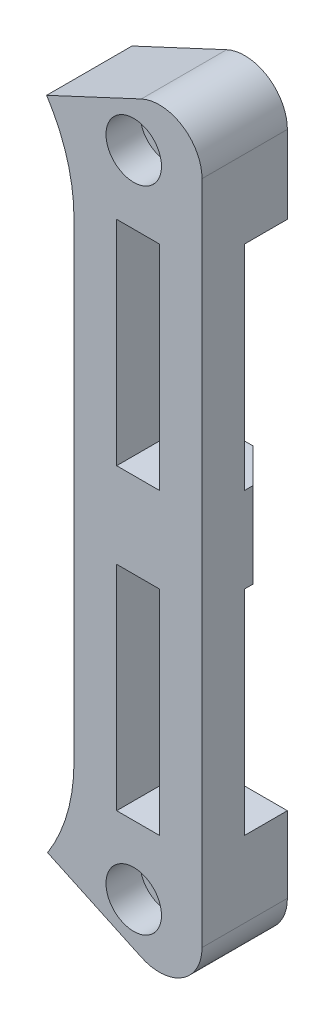
ISO-10303-21;
HEADER;
FILE_DESCRIPTION(('STEP AP214'),'2;1');
FILE_NAME('part.step','',(''),(''),'','','');
FILE_SCHEMA(('AUTOMOTIVE_DESIGN { 1 0 10303 214 1 1 1 1 }'));
ENDSEC;
DATA;
#1=APPLICATION_CONTEXT('core data for automotive mechanical design processes');
#2=APPLICATION_PROTOCOL_DEFINITION('international standard','automotive_design',2000,#1);
#3=PRODUCT_CONTEXT('',#1,'mechanical');
#4=PRODUCT('Part','Part','',(#3));
#5=PRODUCT_RELATED_PRODUCT_CATEGORY('part','',(#4));
#6=PRODUCT_DEFINITION_FORMATION('','',#4);
#7=PRODUCT_DEFINITION_CONTEXT('part definition',#1,'design');
#8=PRODUCT_DEFINITION('design','',#6,#7);
#9=PRODUCT_DEFINITION_SHAPE('','',#8);
#10=(LENGTH_UNIT() NAMED_UNIT(*) SI_UNIT(.MILLI.,.METRE.));
#11=(NAMED_UNIT(*) PLANE_ANGLE_UNIT() SI_UNIT($,.RADIAN.));
#12=(NAMED_UNIT(*) SI_UNIT($,.STERADIAN.) SOLID_ANGLE_UNIT());
#13=UNCERTAINTY_MEASURE_WITH_UNIT(LENGTH_MEASURE(1.E-05),#10,'distance_accuracy_value','');
#14=(GEOMETRIC_REPRESENTATION_CONTEXT(3) GLOBAL_UNCERTAINTY_ASSIGNED_CONTEXT((#13)) GLOBAL_UNIT_ASSIGNED_CONTEXT((#10,
#11,#12)) REPRESENTATION_CONTEXT('',''));
#15=CARTESIAN_POINT('',(0.,0.,0.));
#16=DIRECTION('',(0.,0.,1.));
#17=DIRECTION('',(1.,0.,0.));
#18=AXIS2_PLACEMENT_3D('',#15,#16,#17);
#19=CARTESIAN_POINT('',(-10.,76.7389258347136,4.99999999999999));
#20=DIRECTION('',(0.,0.,1.));
#21=DIRECTION('',(1.,0.,0.));
#22=AXIS2_PLACEMENT_3D('',#19,#20,#21);
#23=PLANE('',#22);
#24=DIRECTION('',(0.,-1.,0.));
#25=VECTOR('',#24,1.);
#26=CARTESIAN_POINT('',(0.,76.7389258347136,4.99999999999999));
#27=LINE('',#26,#25);
#28=CARTESIAN_POINT('',(0.,76.7389258347136,4.99999999999999));
#29=VERTEX_POINT('',#28);
#30=CARTESIAN_POINT('',(0.,51.7389258347136,4.99999999999999));
#31=VERTEX_POINT('',#30);
#32=EDGE_CURVE('E225',#29,#31,#27,.T.);
#33=ORIENTED_EDGE('',*,*,#32,.T.);
#34=DIRECTION('',(-1.,0.,0.));
#35=VECTOR('',#34,1.);
#36=CARTESIAN_POINT('',(-10.,51.7389258347136,4.99999999999999));
#37=LINE('',#36,#35);
#38=CARTESIAN_POINT('',(-3.,51.7389258347136,4.99999999999999));
#39=VERTEX_POINT('',#38);
#40=EDGE_CURVE('E348',#31,#39,#37,.T.);
#41=ORIENTED_EDGE('',*,*,#40,.T.);
#42=DIRECTION('',(0.,1.,0.));
#43=VECTOR('',#42,1.);
#44=CARTESIAN_POINT('',(-3.,76.7389258347136,4.99999999999999));
#45=LINE('',#44,#43);
#46=CARTESIAN_POINT('',(-3.,76.7389258347136,4.99999999999999));
#47=VERTEX_POINT('',#46);
#48=EDGE_CURVE('E309',#39,#47,#45,.T.);
#49=ORIENTED_EDGE('',*,*,#48,.T.);
#50=DIRECTION('',(1.,0.,0.));
#51=VECTOR('',#50,1.);
#52=CARTESIAN_POINT('',(-10.,76.7389258347136,4.99999999999999));
#53=LINE('',#52,#51);
#54=EDGE_CURVE('E235',#47,#29,#53,.T.);
#55=ORIENTED_EDGE('',*,*,#54,.T.);
#56=EDGE_LOOP('',(#33,#41,#49,#55));
#57=FACE_BOUND('',#56,.T.);
#58=ADVANCED_FACE('F33',(#57),#23,.F.);
#59=CARTESIAN_POINT('',(-10.,0.,0.));
#60=DIRECTION('',(-1.,0.,0.));
#61=DIRECTION('',(0.,0.,1.));
#62=AXIS2_PLACEMENT_3D('',#59,#60,#61);
#63=PLANE('',#62);
#64=DIRECTION('',(0.,-1.,0.));
#65=VECTOR('',#64,1.);
#66=CARTESIAN_POINT('',(-10.,74.3641428895241,10.));
#67=LINE('',#66,#65);
#68=CARTESIAN_POINT('',(-10.,76.7389258347136,10.));
#69=VERTEX_POINT('',#68);
#70=CARTESIAN_POINT('',(-10.,51.7389258347136,10.));
#71=VERTEX_POINT('',#70);
#72=EDGE_CURVE('E216',#69,#71,#67,.T.);
#73=ORIENTED_EDGE('',*,*,#72,.T.);
#74=DIRECTION('',(0.,0.,-1.));
#75=VECTOR('',#74,1.);
#76=CARTESIAN_POINT('',(-10.,51.7389258347136,0.));
#77=LINE('',#76,#75);
#78=CARTESIAN_POINT('',(-10.,51.7389258347136,0.));
#79=VERTEX_POINT('',#78);
#80=EDGE_CURVE('E363',#71,#79,#77,.T.);
#81=ORIENTED_EDGE('',*,*,#80,.T.);
#82=DIRECTION('',(0.,1.,0.));
#83=VECTOR('',#82,1.);
#84=CARTESIAN_POINT('',(-10.,76.7389258347136,0.));
#85=LINE('',#84,#83);
#86=CARTESIAN_POINT('',(-10.,76.7389258347136,0.));
#87=VERTEX_POINT('',#86);
#88=EDGE_CURVE('E211',#79,#87,#85,.T.);
#89=ORIENTED_EDGE('',*,*,#88,.T.);
#90=DIRECTION('',(0.,0.,1.));
#91=VECTOR('',#90,1.);
#92=CARTESIAN_POINT('',(-10.,76.7389258347136,0.));
#93=LINE('',#92,#91);
#94=EDGE_CURVE('E210',#87,#69,#93,.T.);
#95=ORIENTED_EDGE('',*,*,#94,.T.);
#96=EDGE_LOOP('',(#73,#81,#89,#95));
#97=FACE_BOUND('',#96,.T.);
#98=ADVANCED_FACE('F393',(#97),#63,.F.);
#99=CARTESIAN_POINT('',(-5.,76.7389258347136,15.));
#100=DIRECTION('',(1.,0.,0.));
#101=DIRECTION('',(0.,0.,-1.));
#102=AXIS2_PLACEMENT_3D('',#99,#100,#101);
#103=PLANE('',#102);
#104=DIRECTION('',(0.,-1.,0.));
#105=VECTOR('',#104,1.);
#106=CARTESIAN_POINT('',(-5.,76.7389258347136,6.99999999999999));
#107=LINE('',#106,#105);
#108=CARTESIAN_POINT('',(-5.,76.7389258347136,6.99999999999999));
#109=VERTEX_POINT('',#108);
#110=CARTESIAN_POINT('',(-5.,51.7389258347136,6.99999999999999));
#111=VERTEX_POINT('',#110);
#112=EDGE_CURVE('E306',#109,#111,#107,.T.);
#113=ORIENTED_EDGE('',*,*,#112,.T.);
#114=DIRECTION('',(0.,0.,1.));
#115=VECTOR('',#114,1.);
#116=CARTESIAN_POINT('',(-5.,51.7389258347136,15.));
#117=LINE('',#116,#115);
#118=CARTESIAN_POINT('',(-5.,51.7389258347136,10.));
#119=VERTEX_POINT('',#118);
#120=EDGE_CURVE('E196',#111,#119,#117,.T.);
#121=ORIENTED_EDGE('',*,*,#120,.T.);
#122=DIRECTION('',(0.,1.,0.));
#123=VECTOR('',#122,1.);
#124=CARTESIAN_POINT('',(-5.,74.3641428895241,10.));
#125=LINE('',#124,#123);
#126=CARTESIAN_POINT('',(-5.,76.7389258347136,10.));
#127=VERTEX_POINT('',#126);
#128=EDGE_CURVE('E383',#119,#127,#125,.T.);
#129=ORIENTED_EDGE('',*,*,#128,.T.);
#130=DIRECTION('',(0.,0.,-1.));
#131=VECTOR('',#130,1.);
#132=CARTESIAN_POINT('',(-5.,76.7389258347136,15.));
#133=LINE('',#132,#131);
#134=EDGE_CURVE('E321',#127,#109,#133,.T.);
#135=ORIENTED_EDGE('',*,*,#134,.T.);
#136=EDGE_LOOP('',(#113,#121,#129,#135));
#137=FACE_BOUND('',#136,.T.);
#138=ADVANCED_FACE('F460',(#137),#103,.F.);
#139=CARTESIAN_POINT('',(-5.,76.7389258347136,6.99999999999999));
#140=DIRECTION('',(0.707106781186547,0.,0.707106781186547));
#141=DIRECTION('',(0.,-1.,0.));
#142=AXIS2_PLACEMENT_3D('',#139,#140,#141);
#143=PLANE('',#142);
#144=DIRECTION('',(-0.707106781186548,0.,0.707106781186548));
#145=VECTOR('',#144,1.);
#146=CARTESIAN_POINT('',(-5.,51.7389258347136,6.99999999999999));
#147=LINE('',#146,#145);
#148=EDGE_CURVE('E330',#111,#39,#147,.F.);
#149=ORIENTED_EDGE('',*,*,#148,.F.);
#150=ORIENTED_EDGE('',*,*,#112,.F.);
#151=DIRECTION('',(0.707106781186548,0.,-0.707106781186548));
#152=VECTOR('',#151,1.);
#153=CARTESIAN_POINT('',(-4.,76.7389258347136,5.99999999999999));
#154=LINE('',#153,#152);
#155=EDGE_CURVE('E315',#47,#109,#154,.F.);
#156=ORIENTED_EDGE('',*,*,#155,.F.);
#157=ORIENTED_EDGE('',*,*,#48,.F.);
#158=EDGE_LOOP('',(#149,#150,#156,#157));
#159=FACE_BOUND('',#158,.T.);
#160=ADVANCED_FACE('F458',(#159),#143,.F.);
#161=CARTESIAN_POINT('',(-8.00000000000024,8.73892583471362,10.));
#162=DIRECTION('',(0.,0.,-1.));
#163=DIRECTION('',(-1.,0.,0.));
#164=AXIS2_PLACEMENT_3D('',#161,#162,#163);
#165=CYLINDRICAL_SURFACE('',#164,2.);
#166=CARTESIAN_POINT('',(-8.00000000000024,8.73892583471362,0.));
#167=DIRECTION('',(0.,0.,1.));
#168=DIRECTION('',(1.,0.,0.));
#169=AXIS2_PLACEMENT_3D('',#166,#167,#168);
#170=CIRCLE('',#169,2.);
#171=CARTESIAN_POINT('',(-6.00000000000024,8.73892583471362,0.));
#172=VERTEX_POINT('',#171);
#173=EDGE_CURVE('E240',#172,#172,#170,.T.);
#174=ORIENTED_EDGE('',*,*,#173,.F.);
#175=EDGE_LOOP('',(#174));
#176=FACE_BOUND('',#175,.T.);
#177=CARTESIAN_POINT('',(-8.00000000000024,8.73892583471362,6.));
#178=DIRECTION('',(0.,0.,1.));
#179=DIRECTION('',(1.,0.,0.));
#180=AXIS2_PLACEMENT_3D('',#177,#178,#179);
#181=CIRCLE('',#180,2.);
#182=CARTESIAN_POINT('',(-6.00000000000024,8.73892583471362,6.));
#183=VERTEX_POINT('',#182);
#184=EDGE_CURVE('E323',#183,#183,#181,.T.);
#185=ORIENTED_EDGE('',*,*,#184,.T.);
#186=EDGE_LOOP('',(#185));
#187=FACE_BOUND('',#186,.T.);
#188=ADVANCED_FACE('F468',(#176,#187),#165,.F.);
#189=CARTESIAN_POINT('',(-8.00000000000021,84.7389258347136,10.));
#190=DIRECTION('',(0.,0.,-1.));
#191=DIRECTION('',(-1.,0.,0.));
#192=AXIS2_PLACEMENT_3D('',#189,#190,#191);
#193=CYLINDRICAL_SURFACE('',#192,2.);
#194=CARTESIAN_POINT('',(-8.00000000000021,84.7389258347136,0.));
#195=DIRECTION('',(0.,0.,1.));
#196=DIRECTION('',(1.,0.,0.));
#197=AXIS2_PLACEMENT_3D('',#194,#195,#196);
#198=CIRCLE('',#197,2.);
#199=CARTESIAN_POINT('',(-6.00000000000021,84.7389258347136,0.));
#200=VERTEX_POINT('',#199);
#201=EDGE_CURVE('E231',#200,#200,#198,.T.);
#202=ORIENTED_EDGE('',*,*,#201,.F.);
#203=EDGE_LOOP('',(#202));
#204=FACE_BOUND('',#203,.T.);
#205=CARTESIAN_POINT('',(-8.00000000000021,84.7389258347136,6.));
#206=DIRECTION('',(0.,0.,1.));
#207=DIRECTION('',(1.,0.,0.));
#208=AXIS2_PLACEMENT_3D('',#205,#206,#207);
#209=CIRCLE('',#208,2.);
#210=CARTESIAN_POINT('',(-6.00000000000021,84.7389258347136,6.));
#211=VERTEX_POINT('',#210);
#212=EDGE_CURVE('E318',#211,#211,#209,.T.);
#213=ORIENTED_EDGE('',*,*,#212,.T.);
#214=EDGE_LOOP('',(#213));
#215=FACE_BOUND('',#214,.T.);
#216=ADVANCED_FACE('F591',(#204,#215),#193,.F.);
#217=CARTESIAN_POINT('',(-34.9999998912664,74.3641428895241,10.));
#218=DIRECTION('',(0.,0.,1.));
#219=DIRECTION('',(1.,0.,0.));
#220=AXIS2_PLACEMENT_3D('',#217,#218,#219);
#221=PLANE('',#220);
#222=ORIENTED_EDGE('',*,*,#128,.F.);
#223=DIRECTION('',(1.,0.,0.));
#224=VECTOR('',#223,1.);
#225=CARTESIAN_POINT('',(-14.,51.7389258347136,10.));
#226=LINE('',#225,#224);
#227=EDGE_CURVE('E353',#71,#119,#226,.T.);
#228=ORIENTED_EDGE('',*,*,#227,.F.);
#229=ORIENTED_EDGE('',*,*,#72,.F.);
#230=DIRECTION('',(-1.,0.,0.));
#231=VECTOR('',#230,1.);
#232=CARTESIAN_POINT('',(-34.9999998912664,76.7389258347136,10.));
#233=LINE('',#232,#231);
#234=EDGE_CURVE('E378',#127,#69,#233,.T.);
#235=ORIENTED_EDGE('',*,*,#234,.F.);
#236=EDGE_LOOP('',(#222,#228,#229,#235));
#237=FACE_BOUND('',#236,.T.);
#238=CARTESIAN_POINT('',(-10.,41.7389258347136,10.));
#239=VERTEX_POINT('',#238);
#240=CARTESIAN_POINT('',(-10.,16.7389258347136,10.));
#241=VERTEX_POINT('',#240);
#242=EDGE_CURVE('E386',#239,#241,#67,.T.);
#243=ORIENTED_EDGE('',*,*,#242,.F.);
#244=DIRECTION('',(1.,0.,0.));
#245=VECTOR('',#244,1.);
#246=CARTESIAN_POINT('',(-14.,41.7389258347136,10.));
#247=LINE('',#246,#245);
#248=CARTESIAN_POINT('',(-5.,41.7389258347136,10.));
#249=VERTEX_POINT('',#248);
#250=EDGE_CURVE('E192',#239,#249,#247,.T.);
#251=ORIENTED_EDGE('',*,*,#250,.T.);
#252=CARTESIAN_POINT('',(-5.,16.7389258347136,10.));
#253=VERTEX_POINT('',#252);
#254=EDGE_CURVE('E384',#253,#249,#125,.T.);
#255=ORIENTED_EDGE('',*,*,#254,.F.);
#256=DIRECTION('',(1.,0.,0.));
#257=VECTOR('',#256,1.);
#258=CARTESIAN_POINT('',(-34.9999998912664,16.7389258347136,10.));
#259=LINE('',#258,#257);
#260=EDGE_CURVE('E385',#241,#253,#259,.T.);
#261=ORIENTED_EDGE('',*,*,#260,.F.);
#262=EDGE_LOOP('',(#243,#251,#255,#261));
#263=FACE_BOUND('',#262,.T.);
#264=DIRECTION('',(0.,1.,0.));
#265=VECTOR('',#264,1.);
#266=CARTESIAN_POINT('',(0.,93.7107928727129,10.));
#267=LINE('',#266,#265);
#268=CARTESIAN_POINT('',(0.,7.84842788558751,10.));
#269=VERTEX_POINT('',#268);
#270=CARTESIAN_POINT('',(0.,85.8623649871254,10.));
#271=VERTEX_POINT('',#270);
#272=EDGE_CURVE('E255',#269,#271,#267,.T.);
#273=ORIENTED_EDGE('',*,*,#272,.T.);
#274=CARTESIAN_POINT('',(-5.,85.8623649871254,10.));
#275=DIRECTION('',(0.,0.,1.));
#276=DIRECTION('',(1.,0.,0.));
#277=AXIS2_PLACEMENT_3D('',#274,#275,#276);
#278=CIRCLE('',#277,5.);
#279=CARTESIAN_POINT('',(-7.11309130870352,90.3939039223087,10.));
#280=VERTEX_POINT('',#279);
#281=EDGE_CURVE('E298',#271,#280,#278,.T.);
#282=ORIENTED_EDGE('',*,*,#281,.T.);
#283=DIRECTION('',(-0.906307787036648,-0.422618261740704,0.));
#284=VECTOR('',#283,1.);
#285=CARTESIAN_POINT('',(-18.2040333666436,85.2221127045378,10.));
#286=LINE('',#285,#284);
#287=CARTESIAN_POINT('',(-18.2040333666436,85.2221127045378,10.));
#288=VERTEX_POINT('',#287);
#289=EDGE_CURVE('E257',#280,#288,#286,.T.);
#290=ORIENTED_EDGE('',*,*,#289,.T.);
#291=CARTESIAN_POINT('',(-34.9999998912664,74.3641428895241,10.));
#292=DIRECTION('',(0.,0.,-1.));
#293=DIRECTION('',(1.,0.,0.));
#294=AXIS2_PLACEMENT_3D('',#291,#292,#293);
#295=CIRCLE('',#294,20.);
#296=CARTESIAN_POINT('',(-15.0000000000002,74.3620573798213,10.));
#297=VERTEX_POINT('',#296);
#298=EDGE_CURVE('E244',#288,#297,#295,.T.);
#299=ORIENTED_EDGE('',*,*,#298,.T.);
#300=DIRECTION('',(0.,-1.,0.));
#301=VECTOR('',#300,1.);
#302=CARTESIAN_POINT('',(-15.0000000000002,19.1157942896059,10.));
#303=LINE('',#302,#301);
#304=CARTESIAN_POINT('',(-15.0000000000002,19.1157942896059,10.));
#305=VERTEX_POINT('',#304);
#306=EDGE_CURVE('E247',#297,#305,#303,.T.);
#307=ORIENTED_EDGE('',*,*,#306,.T.);
#308=CARTESIAN_POINT('',(-35.0000000000002,19.1157942896059,10.));
#309=DIRECTION('',(0.,0.,-1.));
#310=DIRECTION('',(1.,0.,0.));
#311=AXIS2_PLACEMENT_3D('',#308,#309,#310);
#312=CIRCLE('',#311,20.);
#313=CARTESIAN_POINT('',(-18.0903807173959,8.43568306746135,10.));
#314=VERTEX_POINT('',#313);
#315=EDGE_CURVE('E250',#305,#314,#312,.T.);
#316=ORIENTED_EDGE('',*,*,#315,.T.);
#317=DIRECTION('',(0.906307787036648,-0.422618261740704,0.));
#318=VECTOR('',#317,1.);
#319=CARTESIAN_POINT('',(0.,0.,10.));
#320=LINE('',#319,#318);
#321=CARTESIAN_POINT('',(-7.11309130870352,3.31688895040425,10.));
#322=VERTEX_POINT('',#321);
#323=EDGE_CURVE('E252',#314,#322,#320,.T.);
#324=ORIENTED_EDGE('',*,*,#323,.T.);
#325=CARTESIAN_POINT('',(-5.,7.84842788558748,10.));
#326=DIRECTION('',(0.,0.,1.));
#327=DIRECTION('',(1.,0.,0.));
#328=AXIS2_PLACEMENT_3D('',#325,#326,#327);
#329=CIRCLE('',#328,5.);
#330=EDGE_CURVE('E300',#322,#269,#329,.T.);
#331=ORIENTED_EDGE('',*,*,#330,.T.);
#332=EDGE_LOOP('',(#273,#282,#290,#299,#307,#316,#324,#331));
#333=FACE_BOUND('',#332,.T.);
#334=CARTESIAN_POINT('',(-8.00000000000024,8.73892583471362,10.));
#335=DIRECTION('',(0.,0.,1.));
#336=DIRECTION('',(1.,0.,0.));
#337=AXIS2_PLACEMENT_3D('',#334,#335,#336);
#338=CIRCLE('',#337,3.25);
#339=CARTESIAN_POINT('',(-4.75000000000024,8.73892583471362,10.));
#340=VERTEX_POINT('',#339);
#341=EDGE_CURVE('E366',#340,#340,#338,.T.);
#342=ORIENTED_EDGE('',*,*,#341,.F.);
#343=EDGE_LOOP('',(#342));
#344=FACE_BOUND('',#343,.T.);
#345=CARTESIAN_POINT('',(-8.00000000000021,84.7389258347136,10.));
#346=DIRECTION('',(0.,0.,1.));
#347=DIRECTION('',(1.,0.,0.));
#348=AXIS2_PLACEMENT_3D('',#345,#346,#347);
#349=CIRCLE('',#348,3.25);
#350=CARTESIAN_POINT('',(-4.75000000000021,84.7389258347136,10.));
#351=VERTEX_POINT('',#350);
#352=EDGE_CURVE('E326',#351,#351,#349,.T.);
#353=ORIENTED_EDGE('',*,*,#352,.F.);
#354=EDGE_LOOP('',(#353));
#355=FACE_BOUND('',#354,.T.);
#356=ADVANCED_FACE('F400',(#237,#263,#333,#344,#355),#221,.T.);
#357=CARTESIAN_POINT('',(-34.9999998912664,74.3641428895241,0.));
#358=DIRECTION('',(0.,0.,1.));
#359=DIRECTION('',(1.,0.,0.));
#360=AXIS2_PLACEMENT_3D('',#357,#358,#359);
#361=PLANE('',#360);
#362=DIRECTION('',(1.,0.,0.));
#363=VECTOR('',#362,1.);
#364=CARTESIAN_POINT('',(-14.,51.7389258347136,0.));
#365=LINE('',#364,#363);
#366=CARTESIAN_POINT('',(-4.00000000000001,51.7389258347136,0.));
#367=VERTEX_POINT('',#366);
#368=EDGE_CURVE('E204',#79,#367,#365,.T.);
#369=ORIENTED_EDGE('',*,*,#368,.T.);
#370=DIRECTION('',(0.,-1.,0.));
#371=VECTOR('',#370,1.);
#372=CARTESIAN_POINT('',(-4.,74.3641428895241,0.));
#373=LINE('',#372,#371);
#374=CARTESIAN_POINT('',(-4.00000000000001,41.7389258347136,0.));
#375=VERTEX_POINT('',#374);
#376=EDGE_CURVE('E41',#367,#375,#373,.T.);
#377=ORIENTED_EDGE('',*,*,#376,.T.);
#378=DIRECTION('',(1.,0.,0.));
#379=VECTOR('',#378,1.);
#380=CARTESIAN_POINT('',(-14.,41.7389258347136,0.));
#381=LINE('',#380,#379);
#382=CARTESIAN_POINT('',(-10.,41.7389258347136,0.));
#383=VERTEX_POINT('',#382);
#384=EDGE_CURVE('E188',#383,#375,#381,.T.);
#385=ORIENTED_EDGE('',*,*,#384,.F.);
#386=CARTESIAN_POINT('',(-10.,16.7389258347136,0.));
#387=VERTEX_POINT('',#386);
#388=EDGE_CURVE('E203',#387,#383,#85,.T.);
#389=ORIENTED_EDGE('',*,*,#388,.F.);
#390=DIRECTION('',(1.,0.,0.));
#391=VECTOR('',#390,1.);
#392=CARTESIAN_POINT('',(-10.,16.7389258347136,0.));
#393=LINE('',#392,#391);
#394=CARTESIAN_POINT('',(0.,16.7389258347136,0.));
#395=VERTEX_POINT('',#394);
#396=EDGE_CURVE('E229',#387,#395,#393,.T.);
#397=ORIENTED_EDGE('',*,*,#396,.T.);
#398=DIRECTION('',(0.,1.,0.));
#399=VECTOR('',#398,1.);
#400=CARTESIAN_POINT('',(0.,93.7107928727129,0.));
#401=LINE('',#400,#399);
#402=CARTESIAN_POINT('',(0.,7.84842788558751,0.));
#403=VERTEX_POINT('',#402);
#404=EDGE_CURVE('E270',#403,#395,#401,.T.);
#405=ORIENTED_EDGE('',*,*,#404,.F.);
#406=CARTESIAN_POINT('',(-5.,7.84842788558748,0.));
#407=DIRECTION('',(0.,0.,1.));
#408=DIRECTION('',(1.,0.,0.));
#409=AXIS2_PLACEMENT_3D('',#406,#407,#408);
#410=CIRCLE('',#409,5.);
#411=CARTESIAN_POINT('',(-7.11309130870352,3.31688895040425,0.));
#412=VERTEX_POINT('',#411);
#413=EDGE_CURVE('E294',#403,#412,#410,.F.);
#414=ORIENTED_EDGE('',*,*,#413,.T.);
#415=DIRECTION('',(0.906307787036648,-0.422618261740704,0.));
#416=VECTOR('',#415,1.);
#417=CARTESIAN_POINT('',(0.,0.,0.));
#418=LINE('',#417,#416);
#419=CARTESIAN_POINT('',(-18.0903807173959,8.43568306746135,0.));
#420=VERTEX_POINT('',#419);
#421=EDGE_CURVE('E266',#420,#412,#418,.T.);
#422=ORIENTED_EDGE('',*,*,#421,.F.);
#423=CARTESIAN_POINT('',(-35.0000000000002,19.1157942896059,0.));
#424=DIRECTION('',(0.,0.,-1.));
#425=DIRECTION('',(1.,0.,0.));
#426=AXIS2_PLACEMENT_3D('',#423,#424,#425);
#427=CIRCLE('',#426,20.);
#428=CARTESIAN_POINT('',(-15.0000000000002,19.1157942896059,0.));
#429=VERTEX_POINT('',#428);
#430=EDGE_CURVE('E264',#429,#420,#427,.T.);
#431=ORIENTED_EDGE('',*,*,#430,.F.);
#432=DIRECTION('',(0.,-1.,0.));
#433=VECTOR('',#432,1.);
#434=CARTESIAN_POINT('',(-15.0000000000002,19.1157942896059,0.));
#435=LINE('',#434,#433);
#436=CARTESIAN_POINT('',(-15.0000000000002,74.3620573798213,0.));
#437=VERTEX_POINT('',#436);
#438=EDGE_CURVE('E262',#437,#429,#435,.T.);
#439=ORIENTED_EDGE('',*,*,#438,.F.);
#440=CARTESIAN_POINT('',(-34.9999998912664,74.3641428895241,0.));
#441=DIRECTION('',(0.,0.,-1.));
#442=DIRECTION('',(1.,0.,0.));
#443=AXIS2_PLACEMENT_3D('',#440,#441,#442);
#444=CIRCLE('',#443,20.);
#445=CARTESIAN_POINT('',(-18.2040333666436,85.2221127045378,0.));
#446=VERTEX_POINT('',#445);
#447=EDGE_CURVE('E243',#446,#437,#444,.T.);
#448=ORIENTED_EDGE('',*,*,#447,.F.);
#449=DIRECTION('',(-0.906307787036648,-0.422618261740704,0.));
#450=VECTOR('',#449,1.);
#451=CARTESIAN_POINT('',(-18.2040333666436,85.2221127045378,0.));
#452=LINE('',#451,#450);
#453=CARTESIAN_POINT('',(-7.11309130870352,90.3939039223087,0.));
#454=VERTEX_POINT('',#453);
#455=EDGE_CURVE('E248',#454,#446,#452,.T.);
#456=ORIENTED_EDGE('',*,*,#455,.F.);
#457=CARTESIAN_POINT('',(-5.,85.8623649871254,0.));
#458=DIRECTION('',(0.,0.,1.));
#459=DIRECTION('',(1.,0.,0.));
#460=AXIS2_PLACEMENT_3D('',#457,#458,#459);
#461=CIRCLE('',#460,5.);
#462=CARTESIAN_POINT('',(0.,85.8623649871254,0.));
#463=VERTEX_POINT('',#462);
#464=EDGE_CURVE('E291',#454,#463,#461,.F.);
#465=ORIENTED_EDGE('',*,*,#464,.T.);
#466=CARTESIAN_POINT('',(0.,76.7389258347136,0.));
#467=VERTEX_POINT('',#466);
#468=EDGE_CURVE('E269',#467,#463,#401,.T.);
#469=ORIENTED_EDGE('',*,*,#468,.F.);
#470=DIRECTION('',(1.,0.,0.));
#471=VECTOR('',#470,1.);
#472=CARTESIAN_POINT('',(-10.,76.7389258347136,0.));
#473=LINE('',#472,#471);
#474=EDGE_CURVE('E220',#87,#467,#473,.T.);
#475=ORIENTED_EDGE('',*,*,#474,.F.);
#476=ORIENTED_EDGE('',*,*,#88,.F.);
#477=EDGE_LOOP('',(#369,#377,#385,#389,#397,#405,#414,#422,#431,#439,#448,#456,#465,#469,#475,#476));
#478=FACE_BOUND('',#477,.T.);
#479=ORIENTED_EDGE('',*,*,#173,.T.);
#480=EDGE_LOOP('',(#479));
#481=FACE_BOUND('',#480,.T.);
#482=ORIENTED_EDGE('',*,*,#201,.T.);
#483=EDGE_LOOP('',(#482));
#484=FACE_BOUND('',#483,.T.);
#485=ADVANCED_FACE('F200',(#478,#481,#484),#361,.F.);
#486=CARTESIAN_POINT('',(-34.9999998912664,74.3641428895241,10.));
#487=DIRECTION('',(0.,0.,-1.));
#488=DIRECTION('',(-1.,0.,0.));
#489=AXIS2_PLACEMENT_3D('',#486,#487,#488);
#490=CYLINDRICAL_SURFACE('',#489,20.);
#491=ORIENTED_EDGE('',*,*,#447,.T.);
#492=DIRECTION('',(0.,0.,-1.));
#493=VECTOR('',#492,1.);
#494=CARTESIAN_POINT('',(-15.0000000000002,74.3620573798213,10.));
#495=LINE('',#494,#493);
#496=EDGE_CURVE('E282',#297,#437,#495,.T.);
#497=ORIENTED_EDGE('',*,*,#496,.F.);
#498=ORIENTED_EDGE('',*,*,#298,.F.);
#499=DIRECTION('',(0.,0.,-1.));
#500=VECTOR('',#499,1.);
#501=CARTESIAN_POINT('',(-18.2040333666436,85.2221127045378,10.));
#502=LINE('',#501,#500);
#503=EDGE_CURVE('E259',#288,#446,#502,.T.);
#504=ORIENTED_EDGE('',*,*,#503,.T.);
#505=EDGE_LOOP('',(#491,#497,#498,#504));
#506=FACE_BOUND('',#505,.T.);
#507=ADVANCED_FACE('F442',(#506),#490,.F.);
#508=CARTESIAN_POINT('',(-15.0000000000002,19.1157942896059,10.));
#509=DIRECTION('',(1.,0.,0.));
#510=DIRECTION('',(0.,0.,-1.));
#511=AXIS2_PLACEMENT_3D('',#508,#509,#510);
#512=PLANE('',#511);
#513=ORIENTED_EDGE('',*,*,#438,.T.);
#514=DIRECTION('',(0.,0.,-1.));
#515=VECTOR('',#514,1.);
#516=CARTESIAN_POINT('',(-15.0000000000002,19.1157942896059,10.));
#517=LINE('',#516,#515);
#518=EDGE_CURVE('E279',#305,#429,#517,.T.);
#519=ORIENTED_EDGE('',*,*,#518,.F.);
#520=ORIENTED_EDGE('',*,*,#306,.F.);
#521=ORIENTED_EDGE('',*,*,#496,.T.);
#522=EDGE_LOOP('',(#513,#519,#520,#521));
#523=FACE_BOUND('',#522,.T.);
#524=ADVANCED_FACE('F446',(#523),#512,.F.);
#525=CARTESIAN_POINT('',(-35.0000000000002,19.1157942896059,10.));
#526=DIRECTION('',(0.,0.,-1.));
#527=DIRECTION('',(-1.,0.,0.));
#528=AXIS2_PLACEMENT_3D('',#525,#526,#527);
#529=CYLINDRICAL_SURFACE('',#528,20.);
#530=ORIENTED_EDGE('',*,*,#430,.T.);
#531=DIRECTION('',(0.,0.,-1.));
#532=VECTOR('',#531,1.);
#533=CARTESIAN_POINT('',(-18.0903807173959,8.43568306746135,10.));
#534=LINE('',#533,#532);
#535=EDGE_CURVE('E276',#314,#420,#534,.T.);
#536=ORIENTED_EDGE('',*,*,#535,.F.);
#537=ORIENTED_EDGE('',*,*,#315,.F.);
#538=ORIENTED_EDGE('',*,*,#518,.T.);
#539=EDGE_LOOP('',(#530,#536,#537,#538));
#540=FACE_BOUND('',#539,.T.);
#541=ADVANCED_FACE('F448',(#540),#529,.F.);
#542=CARTESIAN_POINT('',(0.,0.,10.));
#543=DIRECTION('',(0.422618261740704,0.906307787036648,0.));
#544=DIRECTION('',(-0.906307787036648,0.422618261740704,0.));
#545=AXIS2_PLACEMENT_3D('',#542,#543,#544);
#546=PLANE('',#545);
#547=ORIENTED_EDGE('',*,*,#421,.T.);
#548=DIRECTION('',(0.,0.,-1.));
#549=VECTOR('',#548,1.);
#550=CARTESIAN_POINT('',(-7.11309130870352,3.31688895040425,10.));
#551=LINE('',#550,#549);
#552=EDGE_CURVE('E296',#412,#322,#551,.F.);
#553=ORIENTED_EDGE('',*,*,#552,.T.);
#554=ORIENTED_EDGE('',*,*,#323,.F.);
#555=ORIENTED_EDGE('',*,*,#535,.T.);
#556=EDGE_LOOP('',(#547,#553,#554,#555));
#557=FACE_BOUND('',#556,.T.);
#558=ADVANCED_FACE('F418',(#557),#546,.F.);
#559=CARTESIAN_POINT('',(0.,93.7107928727129,10.));
#560=DIRECTION('',(-1.,0.,0.));
#561=DIRECTION('',(0.,0.,1.));
#562=AXIS2_PLACEMENT_3D('',#559,#560,#561);
#563=PLANE('',#562);
#564=DIRECTION('',(0.,0.,-1.));
#565=VECTOR('',#564,1.);
#566=CARTESIAN_POINT('',(0.,41.7389258347136,10.));
#567=LINE('',#566,#565);
#568=CARTESIAN_POINT('',(0.,41.7389258347136,4.99999999999999));
#569=VERTEX_POINT('',#568);
#570=CARTESIAN_POINT('',(0.,41.7389258347136,3.99999999999999));
#571=VERTEX_POINT('',#570);
#572=EDGE_CURVE('E344',#569,#571,#567,.T.);
#573=ORIENTED_EDGE('',*,*,#572,.T.);
#574=DIRECTION('',(0.,1.,0.));
#575=VECTOR('',#574,1.);
#576=CARTESIAN_POINT('',(0.,93.7107928727129,3.99999999999999));
#577=LINE('',#576,#575);
#578=CARTESIAN_POINT('',(0.,51.7389258347136,3.99999999999999));
#579=VERTEX_POINT('',#578);
#580=EDGE_CURVE('E333',#571,#579,#577,.T.);
#581=ORIENTED_EDGE('',*,*,#580,.T.);
#582=DIRECTION('',(0.,0.,1.));
#583=VECTOR('',#582,1.);
#584=CARTESIAN_POINT('',(0.,51.7389258347136,10.));
#585=LINE('',#584,#583);
#586=EDGE_CURVE('E341',#579,#31,#585,.T.);
#587=ORIENTED_EDGE('',*,*,#586,.T.);
#588=ORIENTED_EDGE('',*,*,#32,.F.);
#589=DIRECTION('',(0.,0.,1.));
#590=VECTOR('',#589,1.);
#591=CARTESIAN_POINT('',(0.,76.7389258347136,0.));
#592=LINE('',#591,#590);
#593=EDGE_CURVE('E221',#467,#29,#592,.T.);
#594=ORIENTED_EDGE('',*,*,#593,.F.);
#595=ORIENTED_EDGE('',*,*,#468,.T.);
#596=DIRECTION('',(0.,0.,-1.));
#597=VECTOR('',#596,1.);
#598=CARTESIAN_POINT('',(0.,85.8623649871254,10.));
#599=LINE('',#598,#597);
#600=EDGE_CURVE('E285',#463,#271,#599,.F.);
#601=ORIENTED_EDGE('',*,*,#600,.T.);
#602=ORIENTED_EDGE('',*,*,#272,.F.);
#603=DIRECTION('',(0.,0.,-1.));
#604=VECTOR('',#603,1.);
#605=CARTESIAN_POINT('',(0.,7.84842788558748,10.));
#606=LINE('',#605,#604);
#607=EDGE_CURVE('E288',#269,#403,#606,.T.);
#608=ORIENTED_EDGE('',*,*,#607,.T.);
#609=ORIENTED_EDGE('',*,*,#404,.T.);
#610=DIRECTION('',(0.,0.,-1.));
#611=VECTOR('',#610,1.);
#612=CARTESIAN_POINT('',(0.,16.7389258347136,0.));
#613=LINE('',#612,#611);
#614=CARTESIAN_POINT('',(0.,16.7389258347136,4.99999999999999));
#615=VERTEX_POINT('',#614);
#616=EDGE_CURVE('E214',#615,#395,#613,.T.);
#617=ORIENTED_EDGE('',*,*,#616,.F.);
#618=EDGE_CURVE('E224',#569,#615,#27,.T.);
#619=ORIENTED_EDGE('',*,*,#618,.F.);
#620=EDGE_LOOP('',(#573,#581,#587,#588,#594,#595,#601,#602,#608,#609,#617,#619));
#621=FACE_BOUND('',#620,.T.);
#622=ADVANCED_FACE('F339',(#621),#563,.F.);
#623=CARTESIAN_POINT('',(-18.2040333666436,85.2221127045378,10.));
#624=DIRECTION('',(0.422618261740704,-0.906307787036648,0.));
#625=DIRECTION('',(0.906307787036648,0.422618261740704,0.));
#626=AXIS2_PLACEMENT_3D('',#623,#624,#625);
#627=PLANE('',#626);
#628=ORIENTED_EDGE('',*,*,#289,.F.);
#629=DIRECTION('',(0.,0.,-1.));
#630=VECTOR('',#629,1.);
#631=CARTESIAN_POINT('',(-7.11309130870352,90.3939039223087,10.));
#632=LINE('',#631,#630);
#633=EDGE_CURVE('E302',#280,#454,#632,.T.);
#634=ORIENTED_EDGE('',*,*,#633,.T.);
#635=ORIENTED_EDGE('',*,*,#455,.T.);
#636=ORIENTED_EDGE('',*,*,#503,.F.);
#637=EDGE_LOOP('',(#628,#634,#635,#636));
#638=FACE_BOUND('',#637,.T.);
#639=ADVANCED_FACE('F436',(#638),#627,.F.);
#640=CARTESIAN_POINT('',(-5.,7.84842788558748,10.));
#641=DIRECTION('',(0.,0.,-1.));
#642=DIRECTION('',(-1.,0.,0.));
#643=AXIS2_PLACEMENT_3D('',#640,#641,#642);
#644=CYLINDRICAL_SURFACE('',#643,5.);
#645=ORIENTED_EDGE('',*,*,#330,.F.);
#646=ORIENTED_EDGE('',*,*,#552,.F.);
#647=ORIENTED_EDGE('',*,*,#413,.F.);
#648=ORIENTED_EDGE('',*,*,#607,.F.);
#649=EDGE_LOOP('',(#645,#646,#647,#648));
#650=FACE_BOUND('',#649,.T.);
#651=ADVANCED_FACE('F422',(#650),#644,.T.);
#652=CARTESIAN_POINT('',(-5.,85.8623649871254,10.));
#653=DIRECTION('',(0.,0.,-1.));
#654=DIRECTION('',(-1.,0.,0.));
#655=AXIS2_PLACEMENT_3D('',#652,#653,#654);
#656=CYLINDRICAL_SURFACE('',#655,5.);
#657=ORIENTED_EDGE('',*,*,#281,.F.);
#658=ORIENTED_EDGE('',*,*,#600,.F.);
#659=ORIENTED_EDGE('',*,*,#464,.F.);
#660=ORIENTED_EDGE('',*,*,#633,.F.);
#661=EDGE_LOOP('',(#657,#658,#659,#660));
#662=FACE_BOUND('',#661,.T.);
#663=ADVANCED_FACE('F432',(#662),#656,.T.);
#664=CARTESIAN_POINT('',(-10.,16.7389258347136,0.));
#665=DIRECTION('',(0.,-1.,0.));
#666=DIRECTION('',(0.,0.,-1.));
#667=AXIS2_PLACEMENT_3D('',#664,#665,#666);
#668=PLANE('',#667);
#669=ORIENTED_EDGE('',*,*,#616,.T.);
#670=ORIENTED_EDGE('',*,*,#396,.F.);
#671=DIRECTION('',(0.,0.,-1.));
#672=VECTOR('',#671,1.);
#673=CARTESIAN_POINT('',(-10.,16.7389258347136,0.));
#674=LINE('',#673,#672);
#675=EDGE_CURVE('E209',#241,#387,#674,.T.);
#676=ORIENTED_EDGE('',*,*,#675,.F.);
#677=ORIENTED_EDGE('',*,*,#260,.T.);
#678=DIRECTION('',(0.,0.,-1.));
#679=VECTOR('',#678,1.);
#680=CARTESIAN_POINT('',(-5.,16.7389258347136,15.));
#681=LINE('',#680,#679);
#682=CARTESIAN_POINT('',(-5.,16.7389258347136,6.99999999999999));
#683=VERTEX_POINT('',#682);
#684=EDGE_CURVE('E375',#253,#683,#681,.T.);
#685=ORIENTED_EDGE('',*,*,#684,.T.);
#686=DIRECTION('',(-0.707106781186548,0.,0.707106781186548));
#687=VECTOR('',#686,1.);
#688=CARTESIAN_POINT('',(-4.,16.7389258347136,5.99999999999999));
#689=LINE('',#688,#687);
#690=CARTESIAN_POINT('',(-3.,16.7389258347136,4.99999999999999));
#691=VERTEX_POINT('',#690);
#692=EDGE_CURVE('E313',#683,#691,#689,.F.);
#693=ORIENTED_EDGE('',*,*,#692,.T.);
#694=DIRECTION('',(1.,0.,0.));
#695=VECTOR('',#694,1.);
#696=CARTESIAN_POINT('',(-10.,16.7389258347136,4.99999999999999));
#697=LINE('',#696,#695);
#698=EDGE_CURVE('E232',#691,#615,#697,.T.);
#699=ORIENTED_EDGE('',*,*,#698,.T.);
#700=EDGE_LOOP('',(#669,#670,#676,#677,#685,#693,#699));
#701=FACE_BOUND('',#700,.T.);
#702=ADVANCED_FACE('F411',(#701),#668,.F.);
#703=CARTESIAN_POINT('',(-3.,41.7389258347136,4.99999999999999));
#704=VERTEX_POINT('',#703);
#705=EDGE_CURVE('E310',#691,#704,#45,.T.);
#706=ORIENTED_EDGE('',*,*,#705,.T.);
#707=DIRECTION('',(1.,0.,0.));
#708=VECTOR('',#707,1.);
#709=CARTESIAN_POINT('',(-10.,41.7389258347136,4.99999999999999));
#710=LINE('',#709,#708);
#711=EDGE_CURVE('E197',#704,#569,#710,.T.);
#712=ORIENTED_EDGE('',*,*,#711,.T.);
#713=ORIENTED_EDGE('',*,*,#618,.T.);
#714=ORIENTED_EDGE('',*,*,#698,.F.);
#715=EDGE_LOOP('',(#706,#712,#713,#714));
#716=FACE_BOUND('',#715,.T.);
#717=ADVANCED_FACE('F406',(#716),#23,.F.);
#718=CARTESIAN_POINT('',(-10.,76.7389258347136,0.));
#719=DIRECTION('',(0.,1.,0.));
#720=DIRECTION('',(0.,0.,1.));
#721=AXIS2_PLACEMENT_3D('',#718,#719,#720);
#722=PLANE('',#721);
#723=ORIENTED_EDGE('',*,*,#593,.T.);
#724=ORIENTED_EDGE('',*,*,#54,.F.);
#725=ORIENTED_EDGE('',*,*,#155,.T.);
#726=ORIENTED_EDGE('',*,*,#134,.F.);
#727=ORIENTED_EDGE('',*,*,#234,.T.);
#728=ORIENTED_EDGE('',*,*,#94,.F.);
#729=ORIENTED_EDGE('',*,*,#474,.T.);
#730=EDGE_LOOP('',(#723,#724,#725,#726,#727,#728,#729));
#731=FACE_BOUND('',#730,.T.);
#732=ADVANCED_FACE('F450',(#731),#722,.F.);
#733=ORIENTED_EDGE('',*,*,#388,.T.);
#734=DIRECTION('',(0.,0.,1.));
#735=VECTOR('',#734,1.);
#736=CARTESIAN_POINT('',(-10.,41.7389258347136,0.));
#737=LINE('',#736,#735);
#738=EDGE_CURVE('E186',#383,#239,#737,.T.);
#739=ORIENTED_EDGE('',*,*,#738,.T.);
#740=ORIENTED_EDGE('',*,*,#242,.T.);
#741=ORIENTED_EDGE('',*,*,#675,.T.);
#742=EDGE_LOOP('',(#733,#739,#740,#741));
#743=FACE_BOUND('',#742,.T.);
#744=ADVANCED_FACE('F207',(#743),#63,.F.);
#745=ORIENTED_EDGE('',*,*,#254,.T.);
#746=DIRECTION('',(0.,0.,-1.));
#747=VECTOR('',#746,1.);
#748=CARTESIAN_POINT('',(-5.,41.7389258347136,15.));
#749=LINE('',#748,#747);
#750=CARTESIAN_POINT('',(-5.,41.7389258347136,6.99999999999999));
#751=VERTEX_POINT('',#750);
#752=EDGE_CURVE('E356',#249,#751,#749,.T.);
#753=ORIENTED_EDGE('',*,*,#752,.T.);
#754=EDGE_CURVE('E305',#751,#683,#107,.T.);
#755=ORIENTED_EDGE('',*,*,#754,.T.);
#756=ORIENTED_EDGE('',*,*,#684,.F.);
#757=EDGE_LOOP('',(#745,#753,#755,#756));
#758=FACE_BOUND('',#757,.T.);
#759=ADVANCED_FACE('F463',(#758),#103,.F.);
#760=DIRECTION('',(0.707106781186548,0.,-0.707106781186548));
#761=VECTOR('',#760,1.);
#762=CARTESIAN_POINT('',(-5.,41.7389258347136,6.99999999999999));
#763=LINE('',#762,#761);
#764=EDGE_CURVE('E317',#704,#751,#763,.F.);
#765=ORIENTED_EDGE('',*,*,#764,.F.);
#766=ORIENTED_EDGE('',*,*,#705,.F.);
#767=ORIENTED_EDGE('',*,*,#692,.F.);
#768=ORIENTED_EDGE('',*,*,#754,.F.);
#769=EDGE_LOOP('',(#765,#766,#767,#768));
#770=FACE_BOUND('',#769,.T.);
#771=ADVANCED_FACE('F469',(#770),#143,.F.);
#772=CARTESIAN_POINT('',(-8.00000000000021,84.7389258347136,6.));
#773=DIRECTION('',(0.,0.,1.));
#774=DIRECTION('',(1.,0.,0.));
#775=AXIS2_PLACEMENT_3D('',#772,#773,#774);
#776=CYLINDRICAL_SURFACE('',#775,3.25);
#777=CARTESIAN_POINT('',(-8.00000000000021,84.7389258347136,6.));
#778=DIRECTION('',(0.,0.,1.));
#779=DIRECTION('',(1.,0.,0.));
#780=AXIS2_PLACEMENT_3D('',#777,#778,#779);
#781=CIRCLE('',#780,3.25);
#782=CARTESIAN_POINT('',(-4.75000000000021,84.7389258347136,6.));
#783=VERTEX_POINT('',#782);
#784=EDGE_CURVE('E322',#783,#783,#781,.T.);
#785=ORIENTED_EDGE('',*,*,#784,.F.);
#786=EDGE_LOOP('',(#785));
#787=FACE_BOUND('',#786,.T.);
#788=ORIENTED_EDGE('',*,*,#352,.T.);
#789=EDGE_LOOP('',(#788));
#790=FACE_BOUND('',#789,.T.);
#791=ADVANCED_FACE('F504',(#787,#790),#776,.F.);
#792=CARTESIAN_POINT('',(-8.00000000000021,84.7389258347136,6.));
#793=DIRECTION('',(0.,0.,1.));
#794=DIRECTION('',(1.,0.,0.));
#795=AXIS2_PLACEMENT_3D('',#792,#793,#794);
#796=PLANE('',#795);
#797=ORIENTED_EDGE('',*,*,#212,.F.);
#798=EDGE_LOOP('',(#797));
#799=FACE_BOUND('',#798,.T.);
#800=ORIENTED_EDGE('',*,*,#784,.T.);
#801=EDGE_LOOP('',(#800));
#802=FACE_BOUND('',#801,.T.);
#803=ADVANCED_FACE('F512',(#799,#802),#796,.T.);
#804=CARTESIAN_POINT('',(-8.00000000000024,8.73892583471362,6.));
#805=DIRECTION('',(0.,0.,1.));
#806=DIRECTION('',(1.,0.,0.));
#807=AXIS2_PLACEMENT_3D('',#804,#805,#806);
#808=CYLINDRICAL_SURFACE('',#807,3.25);
#809=CARTESIAN_POINT('',(-8.00000000000024,8.73892583471362,6.));
#810=DIRECTION('',(0.,0.,1.));
#811=DIRECTION('',(1.,0.,0.));
#812=AXIS2_PLACEMENT_3D('',#809,#810,#811);
#813=CIRCLE('',#812,3.25);
#814=CARTESIAN_POINT('',(-4.75000000000024,8.73892583471362,6.));
#815=VERTEX_POINT('',#814);
#816=EDGE_CURVE('E327',#815,#815,#813,.T.);
#817=ORIENTED_EDGE('',*,*,#816,.F.);
#818=EDGE_LOOP('',(#817));
#819=FACE_BOUND('',#818,.T.);
#820=ORIENTED_EDGE('',*,*,#341,.T.);
#821=EDGE_LOOP('',(#820));
#822=FACE_BOUND('',#821,.T.);
#823=ADVANCED_FACE('F520',(#819,#822),#808,.F.);
#824=CARTESIAN_POINT('',(-8.00000000000024,8.73892583471362,6.));
#825=DIRECTION('',(0.,0.,1.));
#826=DIRECTION('',(1.,0.,0.));
#827=AXIS2_PLACEMENT_3D('',#824,#825,#826);
#828=PLANE('',#827);
#829=ORIENTED_EDGE('',*,*,#184,.F.);
#830=EDGE_LOOP('',(#829));
#831=FACE_BOUND('',#830,.T.);
#832=ORIENTED_EDGE('',*,*,#816,.T.);
#833=EDGE_LOOP('',(#832));
#834=FACE_BOUND('',#833,.T.);
#835=ADVANCED_FACE('F528',(#831,#834),#828,.T.);
#836=CARTESIAN_POINT('',(-14.,51.7389258347136,10.));
#837=DIRECTION('',(0.,1.,0.));
#838=DIRECTION('',(0.,0.,1.));
#839=AXIS2_PLACEMENT_3D('',#836,#837,#838);
#840=PLANE('',#839);
#841=ORIENTED_EDGE('',*,*,#586,.F.);
#842=DIRECTION('',(0.707106781186549,0.,0.707106781186546));
#843=VECTOR('',#842,1.);
#844=CARTESIAN_POINT('',(-4.00000000000002,51.7389258347136,0.));
#845=LINE('',#844,#843);
#846=EDGE_CURVE('E55',#579,#367,#845,.F.);
#847=ORIENTED_EDGE('',*,*,#846,.T.);
#848=ORIENTED_EDGE('',*,*,#368,.F.);
#849=ORIENTED_EDGE('',*,*,#80,.F.);
#850=ORIENTED_EDGE('',*,*,#227,.T.);
#851=ORIENTED_EDGE('',*,*,#120,.F.);
#852=ORIENTED_EDGE('',*,*,#148,.T.);
#853=ORIENTED_EDGE('',*,*,#40,.F.);
#854=EDGE_LOOP('',(#841,#847,#848,#849,#850,#851,#852,#853));
#855=FACE_BOUND('',#854,.T.);
#856=ADVANCED_FACE('F347',(#855),#840,.T.);
#857=CARTESIAN_POINT('',(-14.,41.7389258347136,10.));
#858=DIRECTION('',(0.,-1.,0.));
#859=DIRECTION('',(0.,0.,-1.));
#860=AXIS2_PLACEMENT_3D('',#857,#858,#859);
#861=PLANE('',#860);
#862=ORIENTED_EDGE('',*,*,#384,.T.);
#863=DIRECTION('',(-0.707106781186549,0.,-0.707106781186546));
#864=VECTOR('',#863,1.);
#865=CARTESIAN_POINT('',(-4.00000000000002,41.7389258347136,0.));
#866=LINE('',#865,#864);
#867=EDGE_CURVE('E11',#375,#571,#866,.F.);
#868=ORIENTED_EDGE('',*,*,#867,.T.);
#869=ORIENTED_EDGE('',*,*,#572,.F.);
#870=ORIENTED_EDGE('',*,*,#711,.F.);
#871=ORIENTED_EDGE('',*,*,#764,.T.);
#872=ORIENTED_EDGE('',*,*,#752,.F.);
#873=ORIENTED_EDGE('',*,*,#250,.F.);
#874=ORIENTED_EDGE('',*,*,#738,.F.);
#875=EDGE_LOOP('',(#862,#868,#869,#870,#871,#872,#873,#874));
#876=FACE_BOUND('',#875,.T.);
#877=ADVANCED_FACE('F187',(#876),#861,.T.);
#878=CARTESIAN_POINT('',(0.,93.7107928727129,3.99999999999999));
#879=DIRECTION('',(-0.707106781186546,0.,0.707106781186549));
#880=DIRECTION('',(0.,1.,0.));
#881=AXIS2_PLACEMENT_3D('',#878,#879,#880);
#882=PLANE('',#881);
#883=ORIENTED_EDGE('',*,*,#867,.F.);
#884=ORIENTED_EDGE('',*,*,#376,.F.);
#885=ORIENTED_EDGE('',*,*,#846,.F.);
#886=ORIENTED_EDGE('',*,*,#580,.F.);
#887=EDGE_LOOP('',(#883,#884,#885,#886));
#888=FACE_BOUND('',#887,.T.);
#889=ADVANCED_FACE('F35',(#888),#882,.F.);
#890=CLOSED_SHELL('',(#58,#98,#138,#160,#188,#216,#356,#485,#507,#524,#541,#558,#622,#639,#651,
#663,#702,#717,#732,#744,#759,#771,#791,#803,#823,#835,#856,#877,#889));
#891=MANIFOLD_SOLID_BREP('B2',#890);
#892=ADVANCED_BREP_SHAPE_REPRESENTATION('',(#18,#891),#14);
#893=SHAPE_DEFINITION_REPRESENTATION(#9,#892);
ENDSEC;
END-ISO-10303-21;
